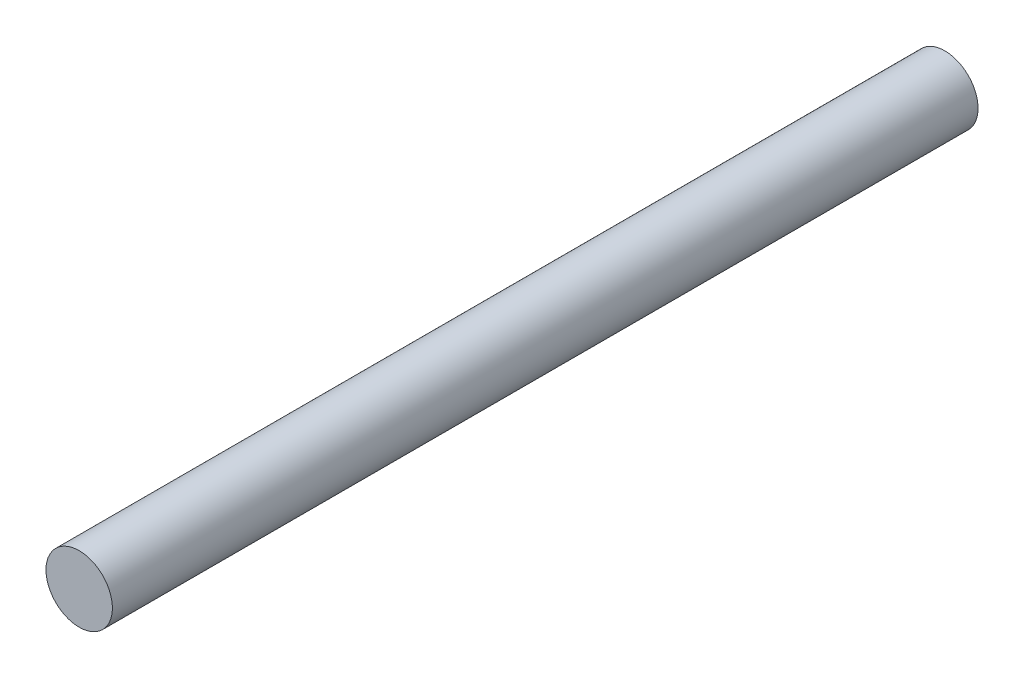
ISO-10303-21;
HEADER;
FILE_DESCRIPTION(('STEP AP214'),'2;1');
FILE_NAME('part.step','',(''),(''),'','','');
FILE_SCHEMA(('AUTOMOTIVE_DESIGN { 1 0 10303 214 1 1 1 1 }'));
ENDSEC;
DATA;
#1=APPLICATION_CONTEXT('core data for automotive mechanical design processes');
#2=APPLICATION_PROTOCOL_DEFINITION('international standard','automotive_design',2000,#1);
#3=PRODUCT_CONTEXT('',#1,'mechanical');
#4=PRODUCT('Part','Part','',(#3));
#5=PRODUCT_RELATED_PRODUCT_CATEGORY('part','',(#4));
#6=PRODUCT_DEFINITION_FORMATION('','',#4);
#7=PRODUCT_DEFINITION_CONTEXT('part definition',#1,'design');
#8=PRODUCT_DEFINITION('design','',#6,#7);
#9=PRODUCT_DEFINITION_SHAPE('','',#8);
#10=(LENGTH_UNIT() NAMED_UNIT(*) SI_UNIT(.MILLI.,.METRE.));
#11=(NAMED_UNIT(*) PLANE_ANGLE_UNIT() SI_UNIT($,.RADIAN.));
#12=(NAMED_UNIT(*) SI_UNIT($,.STERADIAN.) SOLID_ANGLE_UNIT());
#13=UNCERTAINTY_MEASURE_WITH_UNIT(LENGTH_MEASURE(1.E-05),#10,'distance_accuracy_value','');
#14=(GEOMETRIC_REPRESENTATION_CONTEXT(3) GLOBAL_UNCERTAINTY_ASSIGNED_CONTEXT((#13)) GLOBAL_UNIT_ASSIGNED_CONTEXT((#10,
#11,#12)) REPRESENTATION_CONTEXT('',''));
#15=CARTESIAN_POINT('',(0.,0.,0.));
#16=DIRECTION('',(0.,0.,1.));
#17=DIRECTION('',(1.,0.,0.));
#18=AXIS2_PLACEMENT_3D('',#15,#16,#17);
#19=CARTESIAN_POINT('',(0.,0.,76.2));
#20=DIRECTION('',(0.,0.,-1.));
#21=DIRECTION('',(-1.,0.,0.));
#22=AXIS2_PLACEMENT_3D('',#19,#20,#21);
#23=CYLINDRICAL_SURFACE('',#22,2.921);
#24=CARTESIAN_POINT('',(0.,0.,76.2));
#25=DIRECTION('',(0.,0.,1.));
#26=DIRECTION('',(1.,0.,0.));
#27=AXIS2_PLACEMENT_3D('',#24,#25,#26);
#28=CIRCLE('',#27,2.921);
#29=CARTESIAN_POINT('',(-2.921,0.,76.2));
#30=VERTEX_POINT('',#29);
#31=EDGE_CURVE('E10',#30,#30,#28,.T.);
#32=CARTESIAN_POINT('',(0.,0.,0.));
#33=DIRECTION('',(0.,0.,1.));
#34=DIRECTION('',(1.,0.,0.));
#35=AXIS2_PLACEMENT_3D('',#32,#33,#34);
#36=CIRCLE('',#35,2.921);
#37=CARTESIAN_POINT('',(-2.921,0.,0.));
#38=VERTEX_POINT('',#37);
#39=EDGE_CURVE('E40',#38,#38,#36,.T.);
#40=CARTESIAN_POINT('',(-2.921,0.,76.2));
#41=CARTESIAN_POINT('',(-2.921,0.,75.40625));
#42=CARTESIAN_POINT('',(-2.921,0.,74.6125));
#43=CARTESIAN_POINT('',(-2.921,0.,73.025));
#44=CARTESIAN_POINT('',(-2.921,0.,72.23125));
#45=CARTESIAN_POINT('',(-2.921,0.,70.64375));
#46=CARTESIAN_POINT('',(-2.921,0.,69.85));
#47=CARTESIAN_POINT('',(-2.921,0.,68.2625));
#48=CARTESIAN_POINT('',(-2.921,0.,67.46875));
#49=CARTESIAN_POINT('',(-2.921,0.,65.88125));
#50=CARTESIAN_POINT('',(-2.921,0.,65.0875));
#51=CARTESIAN_POINT('',(-2.921,0.,63.5));
#52=CARTESIAN_POINT('',(-2.921,0.,62.70625));
#53=CARTESIAN_POINT('',(-2.921,0.,61.11875));
#54=CARTESIAN_POINT('',(-2.921,0.,60.325));
#55=CARTESIAN_POINT('',(-2.921,0.,58.7375));
#56=CARTESIAN_POINT('',(-2.921,0.,57.94375));
#57=CARTESIAN_POINT('',(-2.921,0.,56.35625));
#58=CARTESIAN_POINT('',(-2.921,0.,55.5625));
#59=CARTESIAN_POINT('',(-2.921,0.,53.975));
#60=CARTESIAN_POINT('',(-2.921,0.,53.18125));
#61=CARTESIAN_POINT('',(-2.921,0.,51.59375));
#62=CARTESIAN_POINT('',(-2.921,0.,50.8));
#63=CARTESIAN_POINT('',(-2.921,0.,49.2125));
#64=CARTESIAN_POINT('',(-2.921,0.,48.41875));
#65=CARTESIAN_POINT('',(-2.921,0.,46.83125));
#66=CARTESIAN_POINT('',(-2.921,0.,46.0375));
#67=CARTESIAN_POINT('',(-2.921,0.,44.45));
#68=CARTESIAN_POINT('',(-2.921,0.,43.65625));
#69=CARTESIAN_POINT('',(-2.921,0.,42.06875));
#70=CARTESIAN_POINT('',(-2.921,0.,41.275));
#71=CARTESIAN_POINT('',(-2.921,0.,39.6875));
#72=CARTESIAN_POINT('',(-2.921,0.,38.89375));
#73=CARTESIAN_POINT('',(-2.921,0.,37.30625));
#74=CARTESIAN_POINT('',(-2.921,0.,36.5125));
#75=CARTESIAN_POINT('',(-2.921,0.,34.925));
#76=CARTESIAN_POINT('',(-2.921,0.,34.13125));
#77=CARTESIAN_POINT('',(-2.921,0.,32.54375));
#78=CARTESIAN_POINT('',(-2.921,0.,31.75));
#79=CARTESIAN_POINT('',(-2.921,0.,30.1625));
#80=CARTESIAN_POINT('',(-2.921,0.,29.36875));
#81=CARTESIAN_POINT('',(-2.921,0.,27.78125));
#82=CARTESIAN_POINT('',(-2.921,0.,26.9875));
#83=CARTESIAN_POINT('',(-2.921,0.,25.4));
#84=CARTESIAN_POINT('',(-2.921,0.,24.60625));
#85=CARTESIAN_POINT('',(-2.921,0.,23.01875));
#86=CARTESIAN_POINT('',(-2.921,0.,22.225));
#87=CARTESIAN_POINT('',(-2.921,0.,20.6375));
#88=CARTESIAN_POINT('',(-2.921,0.,19.84375));
#89=CARTESIAN_POINT('',(-2.921,0.,18.25625));
#90=CARTESIAN_POINT('',(-2.921,0.,17.4625));
#91=CARTESIAN_POINT('',(-2.921,0.,15.875));
#92=CARTESIAN_POINT('',(-2.921,0.,15.08125));
#93=CARTESIAN_POINT('',(-2.921,0.,13.49375));
#94=CARTESIAN_POINT('',(-2.921,0.,12.7));
#95=CARTESIAN_POINT('',(-2.921,0.,11.1125));
#96=CARTESIAN_POINT('',(-2.921,0.,10.31875));
#97=CARTESIAN_POINT('',(-2.921,0.,8.73125));
#98=CARTESIAN_POINT('',(-2.921,0.,7.93750000000001));
#99=CARTESIAN_POINT('',(-2.921,0.,6.35));
#100=CARTESIAN_POINT('',(-2.921,0.,5.55625));
#101=CARTESIAN_POINT('',(-2.921,0.,3.96875));
#102=CARTESIAN_POINT('',(-2.921,0.,3.175));
#103=CARTESIAN_POINT('',(-2.921,0.,1.5875));
#104=CARTESIAN_POINT('',(-2.921,0.,0.793750000000001));
#105=CARTESIAN_POINT('',(-2.921,0.,0.));
#106=B_SPLINE_CURVE_WITH_KNOTS('',3,(#40,#41,#42,#43,#44,#45,#46,#47,#48,#49,#50,#51,#52,#53,
#54,#55,#56,#57,#58,#59,#60,#61,#62,#63,#64,#65,#66,#67,#68,#69,#70,#71,#72,#73,#74,#75,#76,#77,
#78,#79,#80,#81,#82,#83,#84,#85,#86,#87,#88,#89,#90,#91,#92,#93,#94,#95,#96,#97,#98,#99,#100,
#101,#102,#103,#104,#105),.UNSPECIFIED.,.F.,.F.,(4,2,2,2,2,2,2,2,2,2,2,2,2,2,2,2,2,2,2,2,2,2,2,
2,2,2,2,2,2,2,2,2,4),(0.,2.38125,4.7625,7.14375,9.52500000000001,11.90625,14.2875,16.66875,
19.05,21.43125,23.8125,26.19375,28.575,30.95625,33.3375,35.71875,38.1,40.48125,42.8625,45.24375,
47.625,50.00625,52.3875,54.76875,57.15,59.53125,61.9125,64.29375,66.675,69.05625,71.4375,
73.81875,76.2),.UNSPECIFIED.);
#107=EDGE_CURVE('BSEAM37',#30,#38,#106,.T.);
#108=ORIENTED_EDGE('',*,*,#31,.F.);
#109=ORIENTED_EDGE('',*,*,#39,.T.);
#110=ORIENTED_EDGE('',*,*,#107,.T.);
#111=ORIENTED_EDGE('',*,*,#107,.F.);
#112=EDGE_LOOP('',(#108,#110,#109,#111));
#113=FACE_BOUND('',#112,.T.);
#114=ADVANCED_FACE('F37',(#113),#23,.T.);
#115=CARTESIAN_POINT('',(0.,0.,76.2));
#116=DIRECTION('',(0.,0.,1.));
#117=DIRECTION('',(1.,0.,0.));
#118=AXIS2_PLACEMENT_3D('',#115,#116,#117);
#119=PLANE('',#118);
#120=ORIENTED_EDGE('',*,*,#31,.T.);
#121=EDGE_LOOP('',(#120));
#122=FACE_BOUND('',#121,.T.);
#123=ADVANCED_FACE('F54',(#122),#119,.T.);
#124=CARTESIAN_POINT('',(0.,0.,0.));
#125=DIRECTION('',(0.,0.,1.));
#126=DIRECTION('',(1.,0.,0.));
#127=AXIS2_PLACEMENT_3D('',#124,#125,#126);
#128=PLANE('',#127);
#129=ORIENTED_EDGE('',*,*,#39,.F.);
#130=EDGE_LOOP('',(#129));
#131=FACE_BOUND('',#130,.T.);
#132=ADVANCED_FACE('F52',(#131),#128,.F.);
#133=CLOSED_SHELL('',(#114,#123,#132));
#134=MANIFOLD_SOLID_BREP('B2',#133);
#135=ADVANCED_BREP_SHAPE_REPRESENTATION('',(#18,#134),#14);
#136=SHAPE_DEFINITION_REPRESENTATION(#9,#135);
ENDSEC;
END-ISO-10303-21;
